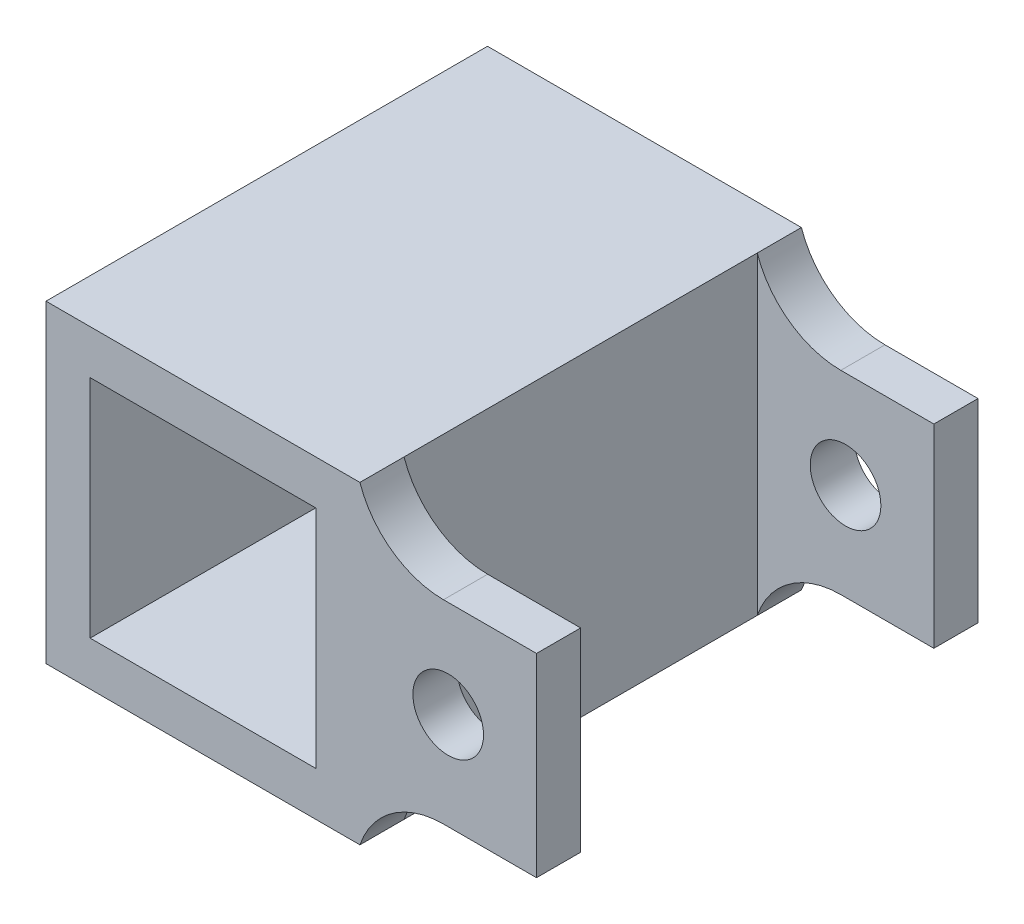
ISO-10303-21;
HEADER;
FILE_DESCRIPTION(('STEP AP214'),'2;1');
FILE_NAME('part.step','',(''),(''),'','','');
FILE_SCHEMA(('AUTOMOTIVE_DESIGN { 1 0 10303 214 1 1 1 1 }'));
ENDSEC;
DATA;
#1=APPLICATION_CONTEXT('core data for automotive mechanical design processes');
#2=APPLICATION_PROTOCOL_DEFINITION('international standard','automotive_design',2000,#1);
#3=PRODUCT_CONTEXT('',#1,'mechanical');
#4=PRODUCT('Part','Part','',(#3));
#5=PRODUCT_RELATED_PRODUCT_CATEGORY('part','',(#4));
#6=PRODUCT_DEFINITION_FORMATION('','',#4);
#7=PRODUCT_DEFINITION_CONTEXT('part definition',#1,'design');
#8=PRODUCT_DEFINITION('design','',#6,#7);
#9=PRODUCT_DEFINITION_SHAPE('','',#8);
#10=(LENGTH_UNIT() NAMED_UNIT(*) SI_UNIT(.MILLI.,.METRE.));
#11=(NAMED_UNIT(*) PLANE_ANGLE_UNIT() SI_UNIT($,.RADIAN.));
#12=(NAMED_UNIT(*) SI_UNIT($,.STERADIAN.) SOLID_ANGLE_UNIT());
#13=UNCERTAINTY_MEASURE_WITH_UNIT(LENGTH_MEASURE(1.E-05),#10,'distance_accuracy_value','');
#14=(GEOMETRIC_REPRESENTATION_CONTEXT(3) GLOBAL_UNCERTAINTY_ASSIGNED_CONTEXT((#13)) GLOBAL_UNIT_ASSIGNED_CONTEXT((#10,
#11,#12)) REPRESENTATION_CONTEXT('',''));
#15=CARTESIAN_POINT('',(0.,0.,0.));
#16=DIRECTION('',(0.,0.,1.));
#17=DIRECTION('',(1.,0.,0.));
#18=AXIS2_PLACEMENT_3D('',#15,#16,#17);
#19=CARTESIAN_POINT('',(17.775,-17.775,25.));
#20=DIRECTION('',(-1.,0.,0.));
#21=DIRECTION('',(0.,0.,1.));
#22=AXIS2_PLACEMENT_3D('',#19,#20,#21);
#23=PLANE('',#22);
#24=DIRECTION('',(0.,0.,-1.));
#25=VECTOR('',#24,1.);
#26=CARTESIAN_POINT('',(17.775,-17.775,25.));
#27=LINE('',#26,#25);
#28=CARTESIAN_POINT('',(17.775,-17.775,20.));
#29=VERTEX_POINT('',#28);
#30=CARTESIAN_POINT('',(17.775,-17.775,-20.));
#31=VERTEX_POINT('',#30);
#32=EDGE_CURVE('E316',#29,#31,#27,.T.);
#33=ORIENTED_EDGE('',*,*,#32,.T.);
#34=DIRECTION('',(0.,-1.,0.));
#35=VECTOR('',#34,1.);
#36=CARTESIAN_POINT('',(17.775,11.,-20.));
#37=LINE('',#36,#35);
#38=CARTESIAN_POINT('',(17.775,17.775,-20.));
#39=VERTEX_POINT('',#38);
#40=EDGE_CURVE('E182',#39,#31,#37,.T.);
#41=ORIENTED_EDGE('',*,*,#40,.F.);
#42=DIRECTION('',(0.,0.,-1.));
#43=VECTOR('',#42,1.);
#44=CARTESIAN_POINT('',(17.775,17.775,25.));
#45=LINE('',#44,#43);
#46=CARTESIAN_POINT('',(17.775,17.775,20.));
#47=VERTEX_POINT('',#46);
#48=EDGE_CURVE('E311',#47,#39,#45,.T.);
#49=ORIENTED_EDGE('',*,*,#48,.F.);
#50=DIRECTION('',(0.,-1.,0.));
#51=VECTOR('',#50,1.);
#52=CARTESIAN_POINT('',(17.775,11.,20.));
#53=LINE('',#52,#51);
#54=EDGE_CURVE('E202',#47,#29,#53,.T.);
#55=ORIENTED_EDGE('',*,*,#54,.T.);
#56=EDGE_LOOP('',(#33,#41,#49,#55));
#57=FACE_BOUND('',#56,.T.);
#58=ADVANCED_FACE('F37',(#57),#23,.F.);
#59=CARTESIAN_POINT('',(0.,0.,25.));
#60=DIRECTION('',(0.,0.,1.));
#61=DIRECTION('',(1.,0.,0.));
#62=AXIS2_PLACEMENT_3D('',#59,#60,#61);
#63=PLANE('',#62);
#64=DIRECTION('',(0.,-1.,0.));
#65=VECTOR('',#64,1.);
#66=CARTESIAN_POINT('',(-17.775,-17.775,25.));
#67=LINE('',#66,#65);
#68=CARTESIAN_POINT('',(-17.775,17.775,25.));
#69=VERTEX_POINT('',#68);
#70=CARTESIAN_POINT('',(-17.775,-17.775,25.));
#71=VERTEX_POINT('',#70);
#72=EDGE_CURVE('E288',#69,#71,#67,.T.);
#73=ORIENTED_EDGE('',*,*,#72,.T.);
#74=DIRECTION('',(1.,0.,0.));
#75=VECTOR('',#74,1.);
#76=CARTESIAN_POINT('',(17.775,-17.775,25.));
#77=LINE('',#76,#75);
#78=CARTESIAN_POINT('',(17.775,-17.775,25.));
#79=VERTEX_POINT('',#78);
#80=EDGE_CURVE('E291',#71,#79,#77,.T.);
#81=ORIENTED_EDGE('',*,*,#80,.T.);
#82=CARTESIAN_POINT('',(27.2406946390637,-21.,25.));
#83=DIRECTION('',(0.,0.,1.));
#84=DIRECTION('',(1.,0.,0.));
#85=AXIS2_PLACEMENT_3D('',#82,#83,#84);
#86=CIRCLE('',#85,10.);
#87=CARTESIAN_POINT('',(27.2406946390637,-11.,25.));
#88=VERTEX_POINT('',#87);
#89=EDGE_CURVE('E352',#79,#88,#86,.F.);
#90=ORIENTED_EDGE('',*,*,#89,.T.);
#91=DIRECTION('',(1.,0.,0.));
#92=VECTOR('',#91,1.);
#93=CARTESIAN_POINT('',(37.775,-11.,25.));
#94=LINE('',#93,#92);
#95=CARTESIAN_POINT('',(37.775,-11.,25.));
#96=VERTEX_POINT('',#95);
#97=EDGE_CURVE('E199',#88,#96,#94,.T.);
#98=ORIENTED_EDGE('',*,*,#97,.T.);
#99=DIRECTION('',(0.,1.,0.));
#100=VECTOR('',#99,1.);
#101=CARTESIAN_POINT('',(37.775,11.,25.));
#102=LINE('',#101,#100);
#103=CARTESIAN_POINT('',(37.775,11.,25.));
#104=VERTEX_POINT('',#103);
#105=EDGE_CURVE('E215',#96,#104,#102,.T.);
#106=ORIENTED_EDGE('',*,*,#105,.T.);
#107=DIRECTION('',(-1.,0.,0.));
#108=VECTOR('',#107,1.);
#109=CARTESIAN_POINT('',(37.775,11.,25.));
#110=LINE('',#109,#108);
#111=CARTESIAN_POINT('',(27.2406946390637,11.,25.));
#112=VERTEX_POINT('',#111);
#113=EDGE_CURVE('E205',#104,#112,#110,.T.);
#114=ORIENTED_EDGE('',*,*,#113,.T.);
#115=CARTESIAN_POINT('',(27.2406946390637,21.,25.));
#116=DIRECTION('',(0.,0.,1.));
#117=DIRECTION('',(1.,0.,0.));
#118=AXIS2_PLACEMENT_3D('',#115,#116,#117);
#119=CIRCLE('',#118,10.);
#120=CARTESIAN_POINT('',(17.775,17.775,25.));
#121=VERTEX_POINT('',#120);
#122=EDGE_CURVE('E357',#112,#121,#119,.F.);
#123=ORIENTED_EDGE('',*,*,#122,.T.);
#124=DIRECTION('',(-1.,0.,0.));
#125=VECTOR('',#124,1.);
#126=CARTESIAN_POINT('',(17.775,17.775,25.));
#127=LINE('',#126,#125);
#128=EDGE_CURVE('E295',#121,#69,#127,.T.);
#129=ORIENTED_EDGE('',*,*,#128,.T.);
#130=EDGE_LOOP('',(#73,#81,#90,#98,#106,#114,#123,#129));
#131=FACE_BOUND('',#130,.T.);
#132=DIRECTION('',(-1.,0.,0.));
#133=VECTOR('',#132,1.);
#134=CARTESIAN_POINT('',(-12.775,12.775,25.));
#135=LINE('',#134,#133);
#136=CARTESIAN_POINT('',(12.775,12.775,25.));
#137=VERTEX_POINT('',#136);
#138=CARTESIAN_POINT('',(-12.775,12.775,25.));
#139=VERTEX_POINT('',#138);
#140=EDGE_CURVE('E257',#137,#139,#135,.T.);
#141=ORIENTED_EDGE('',*,*,#140,.F.);
#142=DIRECTION('',(0.,1.,0.));
#143=VECTOR('',#142,1.);
#144=CARTESIAN_POINT('',(12.775,-12.775,25.));
#145=LINE('',#144,#143);
#146=CARTESIAN_POINT('',(12.775,-12.775,25.));
#147=VERTEX_POINT('',#146);
#148=EDGE_CURVE('E255',#147,#137,#145,.T.);
#149=ORIENTED_EDGE('',*,*,#148,.F.);
#150=DIRECTION('',(1.,0.,0.));
#151=VECTOR('',#150,1.);
#152=CARTESIAN_POINT('',(-12.775,-12.775,25.));
#153=LINE('',#152,#151);
#154=CARTESIAN_POINT('',(-12.775,-12.775,25.));
#155=VERTEX_POINT('',#154);
#156=EDGE_CURVE('E263',#155,#147,#153,.T.);
#157=ORIENTED_EDGE('',*,*,#156,.F.);
#158=DIRECTION('',(0.,-1.,0.));
#159=VECTOR('',#158,1.);
#160=CARTESIAN_POINT('',(-12.775,-12.775,25.));
#161=LINE('',#160,#159);
#162=EDGE_CURVE('E260',#139,#155,#161,.T.);
#163=ORIENTED_EDGE('',*,*,#162,.F.);
#164=EDGE_LOOP('',(#141,#149,#157,#163));
#165=FACE_BOUND('',#164,.T.);
#166=CARTESIAN_POINT('',(27.775,0.,25.));
#167=DIRECTION('',(0.,0.,1.));
#168=DIRECTION('',(1.,0.,0.));
#169=AXIS2_PLACEMENT_3D('',#166,#167,#168);
#170=CIRCLE('',#169,4.00000000000001);
#171=CARTESIAN_POINT('',(31.775,0.,25.));
#172=VERTEX_POINT('',#171);
#173=EDGE_CURVE('E194',#172,#172,#170,.T.);
#174=ORIENTED_EDGE('',*,*,#173,.F.);
#175=EDGE_LOOP('',(#174));
#176=FACE_BOUND('',#175,.T.);
#177=ADVANCED_FACE('F404',(#131,#165,#176),#63,.T.);
#178=CARTESIAN_POINT('',(0.,0.,-25.));
#179=DIRECTION('',(0.,0.,1.));
#180=DIRECTION('',(1.,0.,0.));
#181=AXIS2_PLACEMENT_3D('',#178,#179,#180);
#182=PLANE('',#181);
#183=DIRECTION('',(0.,-1.,0.));
#184=VECTOR('',#183,1.);
#185=CARTESIAN_POINT('',(-17.775,-17.775,-25.));
#186=LINE('',#185,#184);
#187=CARTESIAN_POINT('',(-17.775,17.775,-25.));
#188=VERTEX_POINT('',#187);
#189=CARTESIAN_POINT('',(-17.775,-17.775,-25.));
#190=VERTEX_POINT('',#189);
#191=EDGE_CURVE('E287',#188,#190,#186,.T.);
#192=ORIENTED_EDGE('',*,*,#191,.F.);
#193=DIRECTION('',(-1.,0.,0.));
#194=VECTOR('',#193,1.);
#195=CARTESIAN_POINT('',(17.775,17.775,-25.));
#196=LINE('',#195,#194);
#197=CARTESIAN_POINT('',(17.775,17.775,-25.));
#198=VERTEX_POINT('',#197);
#199=EDGE_CURVE('E292',#198,#188,#196,.T.);
#200=ORIENTED_EDGE('',*,*,#199,.F.);
#201=CARTESIAN_POINT('',(27.2406946390637,21.,-25.));
#202=DIRECTION('',(0.,0.,1.));
#203=DIRECTION('',(1.,0.,0.));
#204=AXIS2_PLACEMENT_3D('',#201,#202,#203);
#205=CIRCLE('',#204,10.);
#206=CARTESIAN_POINT('',(27.2406946390637,11.,-25.));
#207=VERTEX_POINT('',#206);
#208=EDGE_CURVE('E45',#198,#207,#205,.T.);
#209=ORIENTED_EDGE('',*,*,#208,.T.);
#210=DIRECTION('',(-1.,0.,0.));
#211=VECTOR('',#210,1.);
#212=CARTESIAN_POINT('',(37.775,11.,-25.));
#213=LINE('',#212,#211);
#214=CARTESIAN_POINT('',(37.775,11.,-25.));
#215=VERTEX_POINT('',#214);
#216=EDGE_CURVE('E189',#215,#207,#213,.T.);
#217=ORIENTED_EDGE('',*,*,#216,.F.);
#218=DIRECTION('',(0.,1.,0.));
#219=VECTOR('',#218,1.);
#220=CARTESIAN_POINT('',(37.775,11.,-25.));
#221=LINE('',#220,#219);
#222=CARTESIAN_POINT('',(37.775,-11.,-25.));
#223=VERTEX_POINT('',#222);
#224=EDGE_CURVE('E178',#223,#215,#221,.T.);
#225=ORIENTED_EDGE('',*,*,#224,.F.);
#226=DIRECTION('',(1.,0.,0.));
#227=VECTOR('',#226,1.);
#228=CARTESIAN_POINT('',(37.775,-11.,-25.));
#229=LINE('',#228,#227);
#230=CARTESIAN_POINT('',(27.2406946390637,-11.,-25.));
#231=VERTEX_POINT('',#230);
#232=EDGE_CURVE('E184',#231,#223,#229,.T.);
#233=ORIENTED_EDGE('',*,*,#232,.F.);
#234=CARTESIAN_POINT('',(27.2406946390637,-21.,-25.));
#235=DIRECTION('',(0.,0.,1.));
#236=DIRECTION('',(1.,0.,0.));
#237=AXIS2_PLACEMENT_3D('',#234,#235,#236);
#238=CIRCLE('',#237,10.);
#239=CARTESIAN_POINT('',(17.775,-17.775,-25.));
#240=VERTEX_POINT('',#239);
#241=EDGE_CURVE('E365',#231,#240,#238,.T.);
#242=ORIENTED_EDGE('',*,*,#241,.T.);
#243=DIRECTION('',(1.,0.,0.));
#244=VECTOR('',#243,1.);
#245=CARTESIAN_POINT('',(17.775,-17.775,-25.));
#246=LINE('',#245,#244);
#247=EDGE_CURVE('E300',#190,#240,#246,.T.);
#248=ORIENTED_EDGE('',*,*,#247,.F.);
#249=EDGE_LOOP('',(#192,#200,#209,#217,#225,#233,#242,#248));
#250=FACE_BOUND('',#249,.T.);
#251=DIRECTION('',(0.,1.,0.));
#252=VECTOR('',#251,1.);
#253=CARTESIAN_POINT('',(12.775,-12.775,-25.));
#254=LINE('',#253,#252);
#255=CARTESIAN_POINT('',(12.775,-12.775,-25.));
#256=VERTEX_POINT('',#255);
#257=CARTESIAN_POINT('',(12.775,12.775,-25.));
#258=VERTEX_POINT('',#257);
#259=EDGE_CURVE('E266',#256,#258,#254,.T.);
#260=ORIENTED_EDGE('',*,*,#259,.T.);
#261=DIRECTION('',(-1.,0.,0.));
#262=VECTOR('',#261,1.);
#263=CARTESIAN_POINT('',(-12.775,12.775,-25.));
#264=LINE('',#263,#262);
#265=CARTESIAN_POINT('',(-12.775,12.775,-25.));
#266=VERTEX_POINT('',#265);
#267=EDGE_CURVE('E269',#258,#266,#264,.T.);
#268=ORIENTED_EDGE('',*,*,#267,.T.);
#269=DIRECTION('',(0.,-1.,0.));
#270=VECTOR('',#269,1.);
#271=CARTESIAN_POINT('',(-12.775,-12.775,-25.));
#272=LINE('',#271,#270);
#273=CARTESIAN_POINT('',(-12.775,-12.775,-25.));
#274=VERTEX_POINT('',#273);
#275=EDGE_CURVE('E273',#266,#274,#272,.T.);
#276=ORIENTED_EDGE('',*,*,#275,.T.);
#277=DIRECTION('',(1.,0.,0.));
#278=VECTOR('',#277,1.);
#279=CARTESIAN_POINT('',(-12.775,-12.775,-25.));
#280=LINE('',#279,#278);
#281=EDGE_CURVE('E258',#274,#256,#280,.T.);
#282=ORIENTED_EDGE('',*,*,#281,.T.);
#283=EDGE_LOOP('',(#260,#268,#276,#282));
#284=FACE_BOUND('',#283,.T.);
#285=CARTESIAN_POINT('',(27.775,0.,-25.));
#286=DIRECTION('',(0.,0.,1.));
#287=DIRECTION('',(1.,0.,0.));
#288=AXIS2_PLACEMENT_3D('',#285,#286,#287);
#289=CIRCLE('',#288,4.00000000000001);
#290=CARTESIAN_POINT('',(31.775,0.,-25.));
#291=VERTEX_POINT('',#290);
#292=EDGE_CURVE('E824',#291,#291,#289,.T.);
#293=ORIENTED_EDGE('',*,*,#292,.T.);
#294=EDGE_LOOP('',(#293));
#295=FACE_BOUND('',#294,.T.);
#296=ADVANCED_FACE('F378',(#250,#284,#295),#182,.F.);
#297=CARTESIAN_POINT('',(-17.775,-17.775,25.));
#298=DIRECTION('',(1.,0.,0.));
#299=DIRECTION('',(0.,0.,-1.));
#300=AXIS2_PLACEMENT_3D('',#297,#298,#299);
#301=PLANE('',#300);
#302=CARTESIAN_POINT('',(-17.775,-1.975,-15.6));
#303=DIRECTION('',(1.,0.,0.));
#304=DIRECTION('',(0.,0.,-1.));
#305=AXIS2_PLACEMENT_3D('',#302,#303,#304);
#306=CIRCLE('',#305,1.25);
#307=CARTESIAN_POINT('',(-17.775,-1.975,-16.85));
#308=VERTEX_POINT('',#307);
#309=EDGE_CURVE('E270',#308,#308,#306,.T.);
#310=ORIENTED_EDGE('',*,*,#309,.T.);
#311=EDGE_LOOP('',(#310));
#312=FACE_BOUND('',#311,.T.);
#313=CARTESIAN_POINT('',(-17.775,4.42500000000001,15.6));
#314=DIRECTION('',(1.,0.,0.));
#315=DIRECTION('',(0.,0.,-1.));
#316=AXIS2_PLACEMENT_3D('',#313,#314,#315);
#317=CIRCLE('',#316,1.25);
#318=CARTESIAN_POINT('',(-17.775,4.42500000000001,14.35));
#319=VERTEX_POINT('',#318);
#320=EDGE_CURVE('E343',#319,#319,#317,.T.);
#321=ORIENTED_EDGE('',*,*,#320,.T.);
#322=EDGE_LOOP('',(#321));
#323=FACE_BOUND('',#322,.T.);
#324=CARTESIAN_POINT('',(-17.775,4.425,-15.6));
#325=DIRECTION('',(1.,0.,0.));
#326=DIRECTION('',(0.,0.,-1.));
#327=AXIS2_PLACEMENT_3D('',#324,#325,#326);
#328=CIRCLE('',#327,1.25);
#329=CARTESIAN_POINT('',(-17.775,4.425,-16.85));
#330=VERTEX_POINT('',#329);
#331=EDGE_CURVE('E340',#330,#330,#328,.T.);
#332=ORIENTED_EDGE('',*,*,#331,.T.);
#333=EDGE_LOOP('',(#332));
#334=FACE_BOUND('',#333,.T.);
#335=CARTESIAN_POINT('',(-17.775,10.825,15.6));
#336=DIRECTION('',(1.,0.,0.));
#337=DIRECTION('',(0.,0.,-1.));
#338=AXIS2_PLACEMENT_3D('',#335,#336,#337);
#339=CIRCLE('',#338,1.25);
#340=CARTESIAN_POINT('',(-17.775,10.825,14.35));
#341=VERTEX_POINT('',#340);
#342=EDGE_CURVE('E337',#341,#341,#339,.T.);
#343=ORIENTED_EDGE('',*,*,#342,.T.);
#344=EDGE_LOOP('',(#343));
#345=FACE_BOUND('',#344,.T.);
#346=CARTESIAN_POINT('',(-17.775,-14.775,-15.6));
#347=DIRECTION('',(1.,0.,0.));
#348=DIRECTION('',(0.,0.,-1.));
#349=AXIS2_PLACEMENT_3D('',#346,#347,#348);
#350=CIRCLE('',#349,1.25);
#351=CARTESIAN_POINT('',(-17.775,-14.775,-16.85));
#352=VERTEX_POINT('',#351);
#353=EDGE_CURVE('E334',#352,#352,#350,.T.);
#354=ORIENTED_EDGE('',*,*,#353,.T.);
#355=EDGE_LOOP('',(#354));
#356=FACE_BOUND('',#355,.T.);
#357=CARTESIAN_POINT('',(-17.775,-8.37499999999999,15.6));
#358=DIRECTION('',(1.,0.,0.));
#359=DIRECTION('',(0.,0.,-1.));
#360=AXIS2_PLACEMENT_3D('',#357,#358,#359);
#361=CIRCLE('',#360,1.25);
#362=CARTESIAN_POINT('',(-17.775,-8.37499999999999,14.35));
#363=VERTEX_POINT('',#362);
#364=EDGE_CURVE('E331',#363,#363,#361,.T.);
#365=ORIENTED_EDGE('',*,*,#364,.T.);
#366=EDGE_LOOP('',(#365));
#367=FACE_BOUND('',#366,.T.);
#368=CARTESIAN_POINT('',(-17.775,-8.375,-15.6));
#369=DIRECTION('',(1.,0.,0.));
#370=DIRECTION('',(0.,0.,-1.));
#371=AXIS2_PLACEMENT_3D('',#368,#369,#370);
#372=CIRCLE('',#371,1.25);
#373=CARTESIAN_POINT('',(-17.775,-8.375,-16.85));
#374=VERTEX_POINT('',#373);
#375=EDGE_CURVE('E328',#374,#374,#372,.T.);
#376=ORIENTED_EDGE('',*,*,#375,.T.);
#377=EDGE_LOOP('',(#376));
#378=FACE_BOUND('',#377,.T.);
#379=CARTESIAN_POINT('',(-17.775,-1.97499999999999,15.6));
#380=DIRECTION('',(1.,0.,0.));
#381=DIRECTION('',(0.,0.,-1.));
#382=AXIS2_PLACEMENT_3D('',#379,#380,#381);
#383=CIRCLE('',#382,1.25);
#384=CARTESIAN_POINT('',(-17.775,-1.97499999999999,14.35));
#385=VERTEX_POINT('',#384);
#386=EDGE_CURVE('E325',#385,#385,#383,.T.);
#387=ORIENTED_EDGE('',*,*,#386,.T.);
#388=EDGE_LOOP('',(#387));
#389=FACE_BOUND('',#388,.T.);
#390=CARTESIAN_POINT('',(-17.775,10.825,-15.6));
#391=DIRECTION('',(1.,0.,0.));
#392=DIRECTION('',(0.,0.,-1.));
#393=AXIS2_PLACEMENT_3D('',#390,#391,#392);
#394=CIRCLE('',#393,1.25);
#395=CARTESIAN_POINT('',(-17.775,10.825,-16.85));
#396=VERTEX_POINT('',#395);
#397=EDGE_CURVE('E322',#396,#396,#394,.T.);
#398=ORIENTED_EDGE('',*,*,#397,.T.);
#399=EDGE_LOOP('',(#398));
#400=FACE_BOUND('',#399,.T.);
#401=CARTESIAN_POINT('',(-17.775,-14.775,15.6));
#402=DIRECTION('',(1.,0.,0.));
#403=DIRECTION('',(0.,0.,-1.));
#404=AXIS2_PLACEMENT_3D('',#401,#402,#403);
#405=CIRCLE('',#404,1.25);
#406=CARTESIAN_POINT('',(-17.775,-14.775,14.35));
#407=VERTEX_POINT('',#406);
#408=EDGE_CURVE('E254',#407,#407,#405,.T.);
#409=ORIENTED_EDGE('',*,*,#408,.T.);
#410=EDGE_LOOP('',(#409));
#411=FACE_BOUND('',#410,.T.);
#412=ORIENTED_EDGE('',*,*,#191,.T.);
#413=DIRECTION('',(0.,0.,-1.));
#414=VECTOR('',#413,1.);
#415=CARTESIAN_POINT('',(-17.775,-17.775,25.));
#416=LINE('',#415,#414);
#417=EDGE_CURVE('E315',#71,#190,#416,.T.);
#418=ORIENTED_EDGE('',*,*,#417,.F.);
#419=ORIENTED_EDGE('',*,*,#72,.F.);
#420=DIRECTION('',(0.,0.,-1.));
#421=VECTOR('',#420,1.);
#422=CARTESIAN_POINT('',(-17.775,17.775,25.));
#423=LINE('',#422,#421);
#424=EDGE_CURVE('E297',#69,#188,#423,.T.);
#425=ORIENTED_EDGE('',*,*,#424,.T.);
#426=EDGE_LOOP('',(#412,#418,#419,#425));
#427=FACE_BOUND('',#426,.T.);
#428=ADVANCED_FACE('F388',(#312,#323,#334,#345,#356,#367,#378,#389,#400,#411,#427),#301,.F.);
#429=CARTESIAN_POINT('',(17.775,-17.775,25.));
#430=DIRECTION('',(0.,1.,0.));
#431=DIRECTION('',(0.,0.,1.));
#432=AXIS2_PLACEMENT_3D('',#429,#430,#431);
#433=PLANE('',#432);
#434=ORIENTED_EDGE('',*,*,#247,.T.);
#435=EDGE_CURVE('E310',#31,#240,#27,.T.);
#436=ORIENTED_EDGE('',*,*,#435,.F.);
#437=ORIENTED_EDGE('',*,*,#32,.F.);
#438=EDGE_CURVE('E312',#79,#29,#27,.T.);
#439=ORIENTED_EDGE('',*,*,#438,.F.);
#440=ORIENTED_EDGE('',*,*,#80,.F.);
#441=ORIENTED_EDGE('',*,*,#417,.T.);
#442=EDGE_LOOP('',(#434,#436,#437,#439,#440,#441));
#443=FACE_BOUND('',#442,.T.);
#444=ADVANCED_FACE('F381',(#443),#433,.F.);
#445=CARTESIAN_POINT('',(17.775,17.775,25.));
#446=DIRECTION('',(0.,-1.,0.));
#447=DIRECTION('',(0.,0.,-1.));
#448=AXIS2_PLACEMENT_3D('',#445,#446,#447);
#449=PLANE('',#448);
#450=ORIENTED_EDGE('',*,*,#199,.T.);
#451=ORIENTED_EDGE('',*,*,#424,.F.);
#452=ORIENTED_EDGE('',*,*,#128,.F.);
#453=EDGE_CURVE('E307',#121,#47,#45,.T.);
#454=ORIENTED_EDGE('',*,*,#453,.T.);
#455=ORIENTED_EDGE('',*,*,#48,.T.);
#456=EDGE_CURVE('E306',#39,#198,#45,.T.);
#457=ORIENTED_EDGE('',*,*,#456,.T.);
#458=EDGE_LOOP('',(#450,#451,#452,#454,#455,#457));
#459=FACE_BOUND('',#458,.T.);
#460=ADVANCED_FACE('F392',(#459),#449,.F.);
#461=CARTESIAN_POINT('',(12.775,-12.775,25.));
#462=DIRECTION('',(-1.,0.,0.));
#463=DIRECTION('',(0.,0.,1.));
#464=AXIS2_PLACEMENT_3D('',#461,#462,#463);
#465=PLANE('',#464);
#466=ORIENTED_EDGE('',*,*,#259,.F.);
#467=DIRECTION('',(0.,0.,-1.));
#468=VECTOR('',#467,1.);
#469=CARTESIAN_POINT('',(12.775,-12.775,25.));
#470=LINE('',#469,#468);
#471=EDGE_CURVE('E265',#147,#256,#470,.T.);
#472=ORIENTED_EDGE('',*,*,#471,.F.);
#473=ORIENTED_EDGE('',*,*,#148,.T.);
#474=DIRECTION('',(0.,0.,-1.));
#475=VECTOR('',#474,1.);
#476=CARTESIAN_POINT('',(12.775,12.775,25.));
#477=LINE('',#476,#475);
#478=EDGE_CURVE('E284',#137,#258,#477,.T.);
#479=ORIENTED_EDGE('',*,*,#478,.T.);
#480=EDGE_LOOP('',(#466,#472,#473,#479));
#481=FACE_BOUND('',#480,.T.);
#482=ADVANCED_FACE('F555',(#481),#465,.T.);
#483=CARTESIAN_POINT('',(-12.775,12.775,25.));
#484=DIRECTION('',(0.,-1.,0.));
#485=DIRECTION('',(0.,0.,-1.));
#486=AXIS2_PLACEMENT_3D('',#483,#484,#485);
#487=PLANE('',#486);
#488=ORIENTED_EDGE('',*,*,#267,.F.);
#489=ORIENTED_EDGE('',*,*,#478,.F.);
#490=ORIENTED_EDGE('',*,*,#140,.T.);
#491=DIRECTION('',(0.,0.,-1.));
#492=VECTOR('',#491,1.);
#493=CARTESIAN_POINT('',(-12.775,12.775,25.));
#494=LINE('',#493,#492);
#495=EDGE_CURVE('E282',#139,#266,#494,.T.);
#496=ORIENTED_EDGE('',*,*,#495,.T.);
#497=EDGE_LOOP('',(#488,#489,#490,#496));
#498=FACE_BOUND('',#497,.T.);
#499=ADVANCED_FACE('F551',(#498),#487,.T.);
#500=CARTESIAN_POINT('',(-12.775,-12.775,25.));
#501=DIRECTION('',(1.,0.,0.));
#502=DIRECTION('',(0.,0.,-1.));
#503=AXIS2_PLACEMENT_3D('',#500,#501,#502);
#504=PLANE('',#503);
#505=ORIENTED_EDGE('',*,*,#275,.F.);
#506=ORIENTED_EDGE('',*,*,#495,.F.);
#507=ORIENTED_EDGE('',*,*,#162,.T.);
#508=DIRECTION('',(0.,0.,-1.));
#509=VECTOR('',#508,1.);
#510=CARTESIAN_POINT('',(-12.775,-12.775,25.));
#511=LINE('',#510,#509);
#512=EDGE_CURVE('E280',#155,#274,#511,.T.);
#513=ORIENTED_EDGE('',*,*,#512,.T.);
#514=EDGE_LOOP('',(#505,#506,#507,#513));
#515=FACE_BOUND('',#514,.T.);
#516=ADVANCED_FACE('F547',(#515),#504,.T.);
#517=CARTESIAN_POINT('',(-12.775,-12.775,25.));
#518=DIRECTION('',(0.,1.,0.));
#519=DIRECTION('',(0.,0.,1.));
#520=AXIS2_PLACEMENT_3D('',#517,#518,#519);
#521=PLANE('',#520);
#522=ORIENTED_EDGE('',*,*,#281,.F.);
#523=ORIENTED_EDGE('',*,*,#512,.F.);
#524=ORIENTED_EDGE('',*,*,#156,.T.);
#525=ORIENTED_EDGE('',*,*,#471,.T.);
#526=EDGE_LOOP('',(#522,#523,#524,#525));
#527=FACE_BOUND('',#526,.T.);
#528=ADVANCED_FACE('F543',(#527),#521,.T.);
#529=CARTESIAN_POINT('',(-13.775,-14.775,15.6));
#530=DIRECTION('',(-1.,0.,0.));
#531=DIRECTION('',(0.,0.,1.));
#532=AXIS2_PLACEMENT_3D('',#529,#530,#531);
#533=CYLINDRICAL_SURFACE('',#532,1.25);
#534=CARTESIAN_POINT('',(-13.775,-14.775,15.6));
#535=DIRECTION('',(-1.,0.,0.));
#536=DIRECTION('',(0.,0.,1.));
#537=AXIS2_PLACEMENT_3D('',#534,#535,#536);
#538=CIRCLE('',#537,1.25);
#539=CARTESIAN_POINT('',(-13.775,-14.775,16.85));
#540=VERTEX_POINT('',#539);
#541=EDGE_CURVE('E249',#540,#540,#538,.T.);
#542=ORIENTED_EDGE('',*,*,#541,.F.);
#543=EDGE_LOOP('',(#542));
#544=FACE_BOUND('',#543,.T.);
#545=ORIENTED_EDGE('',*,*,#408,.F.);
#546=EDGE_LOOP('',(#545));
#547=FACE_BOUND('',#546,.T.);
#548=ADVANCED_FACE('F539',(#544,#547),#533,.F.);
#549=CARTESIAN_POINT('',(-13.775,-14.775,15.6));
#550=DIRECTION('',(-1.,0.,0.));
#551=DIRECTION('',(0.,0.,1.));
#552=AXIS2_PLACEMENT_3D('',#549,#550,#551);
#553=PLANE('',#552);
#554=ORIENTED_EDGE('',*,*,#541,.T.);
#555=EDGE_LOOP('',(#554));
#556=FACE_BOUND('',#555,.T.);
#557=ADVANCED_FACE('F472',(#556),#553,.T.);
#558=CARTESIAN_POINT('',(-13.775,10.825,-15.6));
#559=DIRECTION('',(-1.,0.,0.));
#560=DIRECTION('',(0.,0.,1.));
#561=AXIS2_PLACEMENT_3D('',#558,#559,#560);
#562=CYLINDRICAL_SURFACE('',#561,1.25);
#563=CARTESIAN_POINT('',(-13.775,10.825,-15.6));
#564=DIRECTION('',(-1.,0.,0.));
#565=DIRECTION('',(0.,0.,1.));
#566=AXIS2_PLACEMENT_3D('',#563,#564,#565);
#567=CIRCLE('',#566,1.25);
#568=CARTESIAN_POINT('',(-13.775,10.825,-14.35));
#569=VERTEX_POINT('',#568);
#570=EDGE_CURVE('E222',#569,#569,#567,.T.);
#571=ORIENTED_EDGE('',*,*,#570,.F.);
#572=EDGE_LOOP('',(#571));
#573=FACE_BOUND('',#572,.T.);
#574=ORIENTED_EDGE('',*,*,#397,.F.);
#575=EDGE_LOOP('',(#574));
#576=FACE_BOUND('',#575,.T.);
#577=ADVANCED_FACE('F468',(#573,#576),#562,.F.);
#578=CARTESIAN_POINT('',(-13.775,10.825,-15.6));
#579=DIRECTION('',(-1.,0.,0.));
#580=DIRECTION('',(0.,0.,1.));
#581=AXIS2_PLACEMENT_3D('',#578,#579,#580);
#582=PLANE('',#581);
#583=ORIENTED_EDGE('',*,*,#570,.T.);
#584=EDGE_LOOP('',(#583));
#585=FACE_BOUND('',#584,.T.);
#586=ADVANCED_FACE('F464',(#585),#582,.T.);
#587=CARTESIAN_POINT('',(-13.775,-1.97499999999999,15.6));
#588=DIRECTION('',(-1.,0.,0.));
#589=DIRECTION('',(0.,0.,1.));
#590=AXIS2_PLACEMENT_3D('',#587,#588,#589);
#591=CYLINDRICAL_SURFACE('',#590,1.25);
#592=CARTESIAN_POINT('',(-13.775,-1.97499999999999,15.6));
#593=DIRECTION('',(-1.,0.,0.));
#594=DIRECTION('',(0.,0.,1.));
#595=AXIS2_PLACEMENT_3D('',#592,#593,#594);
#596=CIRCLE('',#595,1.25);
#597=CARTESIAN_POINT('',(-13.775,-1.97499999999999,16.85));
#598=VERTEX_POINT('',#597);
#599=EDGE_CURVE('E237',#598,#598,#596,.T.);
#600=ORIENTED_EDGE('',*,*,#599,.F.);
#601=EDGE_LOOP('',(#600));
#602=FACE_BOUND('',#601,.T.);
#603=ORIENTED_EDGE('',*,*,#386,.F.);
#604=EDGE_LOOP('',(#603));
#605=FACE_BOUND('',#604,.T.);
#606=ADVANCED_FACE('F467',(#602,#605),#591,.F.);
#607=CARTESIAN_POINT('',(-13.775,-1.97499999999999,15.6));
#608=DIRECTION('',(-1.,0.,0.));
#609=DIRECTION('',(0.,0.,1.));
#610=AXIS2_PLACEMENT_3D('',#607,#608,#609);
#611=PLANE('',#610);
#612=ORIENTED_EDGE('',*,*,#599,.T.);
#613=EDGE_LOOP('',(#612));
#614=FACE_BOUND('',#613,.T.);
#615=ADVANCED_FACE('F515',(#614),#611,.T.);
#616=CARTESIAN_POINT('',(-13.775,-8.375,-15.6));
#617=DIRECTION('',(-1.,0.,0.));
#618=DIRECTION('',(0.,0.,1.));
#619=AXIS2_PLACEMENT_3D('',#616,#617,#618);
#620=CYLINDRICAL_SURFACE('',#619,1.25);
#621=CARTESIAN_POINT('',(-13.775,-8.375,-15.6));
#622=DIRECTION('',(-1.,0.,0.));
#623=DIRECTION('',(0.,0.,1.));
#624=AXIS2_PLACEMENT_3D('',#621,#622,#623);
#625=CIRCLE('',#624,1.25);
#626=CARTESIAN_POINT('',(-13.775,-8.375,-14.35));
#627=VERTEX_POINT('',#626);
#628=EDGE_CURVE('E240',#627,#627,#625,.T.);
#629=ORIENTED_EDGE('',*,*,#628,.F.);
#630=EDGE_LOOP('',(#629));
#631=FACE_BOUND('',#630,.T.);
#632=ORIENTED_EDGE('',*,*,#375,.F.);
#633=EDGE_LOOP('',(#632));
#634=FACE_BOUND('',#633,.T.);
#635=ADVANCED_FACE('F511',(#631,#634),#620,.F.);
#636=CARTESIAN_POINT('',(-13.775,-8.375,-15.6));
#637=DIRECTION('',(-1.,0.,0.));
#638=DIRECTION('',(0.,0.,1.));
#639=AXIS2_PLACEMENT_3D('',#636,#637,#638);
#640=PLANE('',#639);
#641=ORIENTED_EDGE('',*,*,#628,.T.);
#642=EDGE_LOOP('',(#641));
#643=FACE_BOUND('',#642,.T.);
#644=ADVANCED_FACE('F507',(#643),#640,.T.);
#645=CARTESIAN_POINT('',(-13.775,-8.37499999999999,15.6));
#646=DIRECTION('',(-1.,0.,0.));
#647=DIRECTION('',(0.,0.,1.));
#648=AXIS2_PLACEMENT_3D('',#645,#646,#647);
#649=CYLINDRICAL_SURFACE('',#648,1.25);
#650=CARTESIAN_POINT('',(-13.775,-8.37499999999999,15.6));
#651=DIRECTION('',(-1.,0.,0.));
#652=DIRECTION('',(0.,0.,1.));
#653=AXIS2_PLACEMENT_3D('',#650,#651,#652);
#654=CIRCLE('',#653,1.25);
#655=CARTESIAN_POINT('',(-13.775,-8.37499999999999,16.85));
#656=VERTEX_POINT('',#655);
#657=EDGE_CURVE('E243',#656,#656,#654,.T.);
#658=ORIENTED_EDGE('',*,*,#657,.F.);
#659=EDGE_LOOP('',(#658));
#660=FACE_BOUND('',#659,.T.);
#661=ORIENTED_EDGE('',*,*,#364,.F.);
#662=EDGE_LOOP('',(#661));
#663=FACE_BOUND('',#662,.T.);
#664=ADVANCED_FACE('F510',(#660,#663),#649,.F.);
#665=CARTESIAN_POINT('',(-13.775,-8.37499999999999,15.6));
#666=DIRECTION('',(-1.,0.,0.));
#667=DIRECTION('',(0.,0.,1.));
#668=AXIS2_PLACEMENT_3D('',#665,#666,#667);
#669=PLANE('',#668);
#670=ORIENTED_EDGE('',*,*,#657,.T.);
#671=EDGE_LOOP('',(#670));
#672=FACE_BOUND('',#671,.T.);
#673=ADVANCED_FACE('F529',(#672),#669,.T.);
#674=CARTESIAN_POINT('',(-13.775,-14.775,-15.6));
#675=DIRECTION('',(-1.,0.,0.));
#676=DIRECTION('',(0.,0.,1.));
#677=AXIS2_PLACEMENT_3D('',#674,#675,#676);
#678=CYLINDRICAL_SURFACE('',#677,1.25);
#679=CARTESIAN_POINT('',(-13.775,-14.775,-15.6));
#680=DIRECTION('',(-1.,0.,0.));
#681=DIRECTION('',(0.,0.,1.));
#682=AXIS2_PLACEMENT_3D('',#679,#680,#681);
#683=CIRCLE('',#682,1.25);
#684=CARTESIAN_POINT('',(-13.775,-14.775,-14.35));
#685=VERTEX_POINT('',#684);
#686=EDGE_CURVE('E246',#685,#685,#683,.T.);
#687=ORIENTED_EDGE('',*,*,#686,.F.);
#688=EDGE_LOOP('',(#687));
#689=FACE_BOUND('',#688,.T.);
#690=ORIENTED_EDGE('',*,*,#353,.F.);
#691=EDGE_LOOP('',(#690));
#692=FACE_BOUND('',#691,.T.);
#693=ADVANCED_FACE('F525',(#689,#692),#678,.F.);
#694=CARTESIAN_POINT('',(-13.775,-14.775,-15.6));
#695=DIRECTION('',(-1.,0.,0.));
#696=DIRECTION('',(0.,0.,1.));
#697=AXIS2_PLACEMENT_3D('',#694,#695,#696);
#698=PLANE('',#697);
#699=ORIENTED_EDGE('',*,*,#686,.T.);
#700=EDGE_LOOP('',(#699));
#701=FACE_BOUND('',#700,.T.);
#702=ADVANCED_FACE('F490',(#701),#698,.T.);
#703=CARTESIAN_POINT('',(-13.775,10.825,15.6));
#704=DIRECTION('',(-1.,0.,0.));
#705=DIRECTION('',(0.,0.,1.));
#706=AXIS2_PLACEMENT_3D('',#703,#704,#705);
#707=CYLINDRICAL_SURFACE('',#706,1.25);
#708=CARTESIAN_POINT('',(-13.775,10.825,15.6));
#709=DIRECTION('',(-1.,0.,0.));
#710=DIRECTION('',(0.,0.,1.));
#711=AXIS2_PLACEMENT_3D('',#708,#709,#710);
#712=CIRCLE('',#711,1.25);
#713=CARTESIAN_POINT('',(-13.775,10.825,16.85));
#714=VERTEX_POINT('',#713);
#715=EDGE_CURVE('E227',#714,#714,#712,.T.);
#716=ORIENTED_EDGE('',*,*,#715,.F.);
#717=EDGE_LOOP('',(#716));
#718=FACE_BOUND('',#717,.T.);
#719=ORIENTED_EDGE('',*,*,#342,.F.);
#720=EDGE_LOOP('',(#719));
#721=FACE_BOUND('',#720,.T.);
#722=ADVANCED_FACE('F486',(#718,#721),#707,.F.);
#723=CARTESIAN_POINT('',(-13.775,10.825,15.6));
#724=DIRECTION('',(-1.,0.,0.));
#725=DIRECTION('',(0.,0.,1.));
#726=AXIS2_PLACEMENT_3D('',#723,#724,#725);
#727=PLANE('',#726);
#728=ORIENTED_EDGE('',*,*,#715,.T.);
#729=EDGE_LOOP('',(#728));
#730=FACE_BOUND('',#729,.T.);
#731=ADVANCED_FACE('F482',(#730),#727,.T.);
#732=CARTESIAN_POINT('',(-13.775,4.425,-15.6));
#733=DIRECTION('',(-1.,0.,0.));
#734=DIRECTION('',(0.,0.,1.));
#735=AXIS2_PLACEMENT_3D('',#732,#733,#734);
#736=CYLINDRICAL_SURFACE('',#735,1.25);
#737=CARTESIAN_POINT('',(-13.775,4.425,-15.6));
#738=DIRECTION('',(-1.,0.,0.));
#739=DIRECTION('',(0.,0.,1.));
#740=AXIS2_PLACEMENT_3D('',#737,#738,#739);
#741=CIRCLE('',#740,1.25);
#742=CARTESIAN_POINT('',(-13.775,4.425,-14.35));
#743=VERTEX_POINT('',#742);
#744=EDGE_CURVE('E228',#743,#743,#741,.T.);
#745=ORIENTED_EDGE('',*,*,#744,.F.);
#746=EDGE_LOOP('',(#745));
#747=FACE_BOUND('',#746,.T.);
#748=ORIENTED_EDGE('',*,*,#331,.F.);
#749=EDGE_LOOP('',(#748));
#750=FACE_BOUND('',#749,.T.);
#751=ADVANCED_FACE('F478',(#747,#750),#736,.F.);
#752=CARTESIAN_POINT('',(-13.775,4.425,-15.6));
#753=DIRECTION('',(-1.,0.,0.));
#754=DIRECTION('',(0.,0.,1.));
#755=AXIS2_PLACEMENT_3D('',#752,#753,#754);
#756=PLANE('',#755);
#757=ORIENTED_EDGE('',*,*,#744,.T.);
#758=EDGE_LOOP('',(#757));
#759=FACE_BOUND('',#758,.T.);
#760=ADVANCED_FACE('F474',(#759),#756,.T.);
#761=CARTESIAN_POINT('',(-13.775,4.42500000000001,15.6));
#762=DIRECTION('',(-1.,0.,0.));
#763=DIRECTION('',(0.,0.,1.));
#764=AXIS2_PLACEMENT_3D('',#761,#762,#763);
#765=CYLINDRICAL_SURFACE('',#764,1.25);
#766=CARTESIAN_POINT('',(-13.775,4.42500000000001,15.6));
#767=DIRECTION('',(-1.,0.,0.));
#768=DIRECTION('',(0.,0.,1.));
#769=AXIS2_PLACEMENT_3D('',#766,#767,#768);
#770=CIRCLE('',#769,1.25);
#771=CARTESIAN_POINT('',(-13.775,4.42500000000001,16.85));
#772=VERTEX_POINT('',#771);
#773=EDGE_CURVE('E231',#772,#772,#770,.T.);
#774=ORIENTED_EDGE('',*,*,#773,.F.);
#775=EDGE_LOOP('',(#774));
#776=FACE_BOUND('',#775,.T.);
#777=ORIENTED_EDGE('',*,*,#320,.F.);
#778=EDGE_LOOP('',(#777));
#779=FACE_BOUND('',#778,.T.);
#780=ADVANCED_FACE('F477',(#776,#779),#765,.F.);
#781=CARTESIAN_POINT('',(-13.775,4.42500000000001,15.6));
#782=DIRECTION('',(-1.,0.,0.));
#783=DIRECTION('',(0.,0.,1.));
#784=AXIS2_PLACEMENT_3D('',#781,#782,#783);
#785=PLANE('',#784);
#786=ORIENTED_EDGE('',*,*,#773,.T.);
#787=EDGE_LOOP('',(#786));
#788=FACE_BOUND('',#787,.T.);
#789=ADVANCED_FACE('F499',(#788),#785,.T.);
#790=CARTESIAN_POINT('',(-13.775,-1.975,-15.6));
#791=DIRECTION('',(-1.,0.,0.));
#792=DIRECTION('',(0.,0.,1.));
#793=AXIS2_PLACEMENT_3D('',#790,#791,#792);
#794=CYLINDRICAL_SURFACE('',#793,1.25);
#795=CARTESIAN_POINT('',(-13.775,-1.975,-15.6));
#796=DIRECTION('',(-1.,0.,0.));
#797=DIRECTION('',(0.,0.,1.));
#798=AXIS2_PLACEMENT_3D('',#795,#796,#797);
#799=CIRCLE('',#798,1.25);
#800=CARTESIAN_POINT('',(-13.775,-1.975,-14.35));
#801=VERTEX_POINT('',#800);
#802=EDGE_CURVE('E234',#801,#801,#799,.T.);
#803=ORIENTED_EDGE('',*,*,#802,.F.);
#804=EDGE_LOOP('',(#803));
#805=FACE_BOUND('',#804,.T.);
#806=ORIENTED_EDGE('',*,*,#309,.F.);
#807=EDGE_LOOP('',(#806));
#808=FACE_BOUND('',#807,.T.);
#809=ADVANCED_FACE('F495',(#805,#808),#794,.F.);
#810=CARTESIAN_POINT('',(-13.775,-1.975,-15.6));
#811=DIRECTION('',(-1.,0.,0.));
#812=DIRECTION('',(0.,0.,1.));
#813=AXIS2_PLACEMENT_3D('',#810,#811,#812);
#814=PLANE('',#813);
#815=ORIENTED_EDGE('',*,*,#802,.T.);
#816=EDGE_LOOP('',(#815));
#817=FACE_BOUND('',#816,.T.);
#818=ADVANCED_FACE('F492',(#817),#814,.T.);
#819=CARTESIAN_POINT('',(37.775,11.,20.));
#820=DIRECTION('',(0.,1.,0.));
#821=DIRECTION('',(-1.,0.,0.));
#822=AXIS2_PLACEMENT_3D('',#819,#820,#821);
#823=PLANE('',#822);
#824=DIRECTION('',(-1.,0.,0.));
#825=VECTOR('',#824,1.);
#826=CARTESIAN_POINT('',(37.775,11.,20.));
#827=LINE('',#826,#825);
#828=CARTESIAN_POINT('',(37.775,11.,20.));
#829=VERTEX_POINT('',#828);
#830=CARTESIAN_POINT('',(27.2406946390637,11.,20.));
#831=VERTEX_POINT('',#830);
#832=EDGE_CURVE('E210',#829,#831,#827,.T.);
#833=ORIENTED_EDGE('',*,*,#832,.T.);
#834=DIRECTION('',(0.,0.,-1.));
#835=VECTOR('',#834,1.);
#836=CARTESIAN_POINT('',(27.2406946390637,11.,25.));
#837=LINE('',#836,#835);
#838=EDGE_CURVE('E349',#831,#112,#837,.F.);
#839=ORIENTED_EDGE('',*,*,#838,.T.);
#840=ORIENTED_EDGE('',*,*,#113,.F.);
#841=DIRECTION('',(0.,0.,1.));
#842=VECTOR('',#841,1.);
#843=CARTESIAN_POINT('',(37.775,11.,20.));
#844=LINE('',#843,#842);
#845=EDGE_CURVE('E220',#829,#104,#844,.T.);
#846=ORIENTED_EDGE('',*,*,#845,.F.);
#847=EDGE_LOOP('',(#833,#839,#840,#846));
#848=FACE_BOUND('',#847,.T.);
#849=ADVANCED_FACE('F440',(#848),#823,.T.);
#850=CARTESIAN_POINT('',(37.775,11.,20.));
#851=DIRECTION('',(1.,0.,0.));
#852=DIRECTION('',(0.,0.,-1.));
#853=AXIS2_PLACEMENT_3D('',#850,#851,#852);
#854=PLANE('',#853);
#855=ORIENTED_EDGE('',*,*,#105,.F.);
#856=DIRECTION('',(0.,0.,1.));
#857=VECTOR('',#856,1.);
#858=CARTESIAN_POINT('',(37.775,-11.,20.));
#859=LINE('',#858,#857);
#860=CARTESIAN_POINT('',(37.775,-11.,20.));
#861=VERTEX_POINT('',#860);
#862=EDGE_CURVE('E213',#861,#96,#859,.T.);
#863=ORIENTED_EDGE('',*,*,#862,.F.);
#864=DIRECTION('',(0.,1.,0.));
#865=VECTOR('',#864,1.);
#866=CARTESIAN_POINT('',(37.775,11.,20.));
#867=LINE('',#866,#865);
#868=EDGE_CURVE('E207',#861,#829,#867,.T.);
#869=ORIENTED_EDGE('',*,*,#868,.T.);
#870=ORIENTED_EDGE('',*,*,#845,.T.);
#871=EDGE_LOOP('',(#855,#863,#869,#870));
#872=FACE_BOUND('',#871,.T.);
#873=ADVANCED_FACE('F445',(#872),#854,.T.);
#874=CARTESIAN_POINT('',(37.775,-11.,20.));
#875=DIRECTION('',(0.,-1.,0.));
#876=DIRECTION('',(1.,0.,0.));
#877=AXIS2_PLACEMENT_3D('',#874,#875,#876);
#878=PLANE('',#877);
#879=ORIENTED_EDGE('',*,*,#97,.F.);
#880=DIRECTION('',(0.,0.,1.));
#881=VECTOR('',#880,1.);
#882=CARTESIAN_POINT('',(27.2406946390637,-11.,20.));
#883=LINE('',#882,#881);
#884=CARTESIAN_POINT('',(27.2406946390637,-11.,20.));
#885=VERTEX_POINT('',#884);
#886=EDGE_CURVE('E319',#88,#885,#883,.F.);
#887=ORIENTED_EDGE('',*,*,#886,.T.);
#888=DIRECTION('',(1.,0.,0.));
#889=VECTOR('',#888,1.);
#890=CARTESIAN_POINT('',(37.775,-11.,20.));
#891=LINE('',#890,#889);
#892=EDGE_CURVE('E204',#885,#861,#891,.T.);
#893=ORIENTED_EDGE('',*,*,#892,.T.);
#894=ORIENTED_EDGE('',*,*,#862,.T.);
#895=EDGE_LOOP('',(#879,#887,#893,#894));
#896=FACE_BOUND('',#895,.T.);
#897=ADVANCED_FACE('F452',(#896),#878,.T.);
#898=CARTESIAN_POINT('',(0.,0.,20.));
#899=DIRECTION('',(0.,0.,-1.));
#900=DIRECTION('',(-1.,0.,0.));
#901=AXIS2_PLACEMENT_3D('',#898,#899,#900);
#902=PLANE('',#901);
#903=CARTESIAN_POINT('',(27.775,0.,20.));
#904=DIRECTION('',(0.,0.,1.));
#905=DIRECTION('',(1.,0.,0.));
#906=AXIS2_PLACEMENT_3D('',#903,#904,#905);
#907=CIRCLE('',#906,4.00000000000001);
#908=CARTESIAN_POINT('',(31.775,0.,20.));
#909=VERTEX_POINT('',#908);
#910=EDGE_CURVE('E196',#909,#909,#907,.T.);
#911=ORIENTED_EDGE('',*,*,#910,.T.);
#912=EDGE_LOOP('',(#911));
#913=FACE_BOUND('',#912,.T.);
#914=ORIENTED_EDGE('',*,*,#54,.F.);
#915=CARTESIAN_POINT('',(27.2406946390637,21.,20.));
#916=DIRECTION('',(0.,0.,-1.));
#917=DIRECTION('',(-1.,0.,0.));
#918=AXIS2_PLACEMENT_3D('',#915,#916,#917);
#919=CIRCLE('',#918,10.);
#920=EDGE_CURVE('E359',#47,#831,#919,.F.);
#921=ORIENTED_EDGE('',*,*,#920,.T.);
#922=ORIENTED_EDGE('',*,*,#832,.F.);
#923=ORIENTED_EDGE('',*,*,#868,.F.);
#924=ORIENTED_EDGE('',*,*,#892,.F.);
#925=CARTESIAN_POINT('',(27.2406946390637,-21.,20.));
#926=DIRECTION('',(0.,0.,-1.));
#927=DIRECTION('',(-1.,0.,0.));
#928=AXIS2_PLACEMENT_3D('',#925,#926,#927);
#929=CIRCLE('',#928,10.);
#930=EDGE_CURVE('E354',#885,#29,#929,.F.);
#931=ORIENTED_EDGE('',*,*,#930,.T.);
#932=EDGE_LOOP('',(#914,#921,#922,#923,#924,#931));
#933=FACE_BOUND('',#932,.T.);
#934=ADVANCED_FACE('F437',(#913,#933),#902,.T.);
#935=CARTESIAN_POINT('',(27.775,0.,20.));
#936=DIRECTION('',(0.,0.,1.));
#937=DIRECTION('',(1.,0.,0.));
#938=AXIS2_PLACEMENT_3D('',#935,#936,#937);
#939=CYLINDRICAL_SURFACE('',#938,4.00000000000001);
#940=ORIENTED_EDGE('',*,*,#910,.F.);
#941=EDGE_LOOP('',(#940));
#942=FACE_BOUND('',#941,.T.);
#943=ORIENTED_EDGE('',*,*,#173,.T.);
#944=EDGE_LOOP('',(#943));
#945=FACE_BOUND('',#944,.T.);
#946=ADVANCED_FACE('F424',(#942,#945),#939,.F.);
#947=CARTESIAN_POINT('',(27.2406946390637,-21.,25.));
#948=DIRECTION('',(0.,0.,-1.));
#949=DIRECTION('',(-1.,0.,0.));
#950=AXIS2_PLACEMENT_3D('',#947,#948,#949);
#951=CYLINDRICAL_SURFACE('',#950,10.);
#952=ORIENTED_EDGE('',*,*,#930,.F.);
#953=ORIENTED_EDGE('',*,*,#886,.F.);
#954=ORIENTED_EDGE('',*,*,#89,.F.);
#955=ORIENTED_EDGE('',*,*,#438,.T.);
#956=EDGE_LOOP('',(#952,#953,#954,#955));
#957=FACE_BOUND('',#956,.T.);
#958=ADVANCED_FACE('F420',(#957),#951,.F.);
#959=CARTESIAN_POINT('',(27.2406946390637,21.,25.));
#960=DIRECTION('',(0.,0.,1.));
#961=DIRECTION('',(1.,0.,0.));
#962=AXIS2_PLACEMENT_3D('',#959,#960,#961);
#963=CYLINDRICAL_SURFACE('',#962,10.);
#964=ORIENTED_EDGE('',*,*,#920,.F.);
#965=ORIENTED_EDGE('',*,*,#453,.F.);
#966=ORIENTED_EDGE('',*,*,#122,.F.);
#967=ORIENTED_EDGE('',*,*,#838,.F.);
#968=EDGE_LOOP('',(#964,#965,#966,#967));
#969=FACE_BOUND('',#968,.T.);
#970=ADVANCED_FACE('F423',(#969),#963,.F.);
#971=CARTESIAN_POINT('',(0.,0.,-20.));
#972=DIRECTION('',(0.,0.,1.));
#973=DIRECTION('',(-1.,0.,0.));
#974=AXIS2_PLACEMENT_3D('',#971,#972,#973);
#975=PLANE('',#974);
#976=ORIENTED_EDGE('',*,*,#40,.T.);
#977=CARTESIAN_POINT('',(27.2406946390637,-21.,-20.));
#978=DIRECTION('',(0.,0.,1.));
#979=DIRECTION('',(1.,0.,0.));
#980=AXIS2_PLACEMENT_3D('',#977,#978,#979);
#981=CIRCLE('',#980,10.);
#982=CARTESIAN_POINT('',(27.2406946390637,-11.,-20.));
#983=VERTEX_POINT('',#982);
#984=EDGE_CURVE('E367',#31,#983,#981,.F.);
#985=ORIENTED_EDGE('',*,*,#984,.T.);
#986=DIRECTION('',(1.,0.,0.));
#987=VECTOR('',#986,1.);
#988=CARTESIAN_POINT('',(37.775,-11.,-20.));
#989=LINE('',#988,#987);
#990=CARTESIAN_POINT('',(37.775,-11.,-20.));
#991=VERTEX_POINT('',#990);
#992=EDGE_CURVE('E169',#983,#991,#989,.T.);
#993=ORIENTED_EDGE('',*,*,#992,.T.);
#994=DIRECTION('',(0.,1.,0.));
#995=VECTOR('',#994,1.);
#996=CARTESIAN_POINT('',(37.775,11.,-20.));
#997=LINE('',#996,#995);
#998=CARTESIAN_POINT('',(37.775,11.,-20.));
#999=VERTEX_POINT('',#998);
#1000=EDGE_CURVE('E162',#991,#999,#997,.T.);
#1001=ORIENTED_EDGE('',*,*,#1000,.T.);
#1002=DIRECTION('',(-1.,0.,0.));
#1003=VECTOR('',#1002,1.);
#1004=CARTESIAN_POINT('',(37.775,11.,-20.));
#1005=LINE('',#1004,#1003);
#1006=CARTESIAN_POINT('',(27.2406946390637,11.,-20.));
#1007=VERTEX_POINT('',#1006);
#1008=EDGE_CURVE('E166',#999,#1007,#1005,.T.);
#1009=ORIENTED_EDGE('',*,*,#1008,.T.);
#1010=CARTESIAN_POINT('',(27.2406946390637,21.,-20.));
#1011=DIRECTION('',(0.,0.,1.));
#1012=DIRECTION('',(1.,0.,0.));
#1013=AXIS2_PLACEMENT_3D('',#1010,#1011,#1012);
#1014=CIRCLE('',#1013,10.);
#1015=EDGE_CURVE('E11',#1007,#39,#1014,.F.);
#1016=ORIENTED_EDGE('',*,*,#1015,.T.);
#1017=EDGE_LOOP('',(#976,#985,#993,#1001,#1009,#1016));
#1018=FACE_BOUND('',#1017,.T.);
#1019=CARTESIAN_POINT('',(27.775,0.,-20.));
#1020=DIRECTION('',(0.,0.,1.));
#1021=DIRECTION('',(1.,0.,0.));
#1022=AXIS2_PLACEMENT_3D('',#1019,#1020,#1021);
#1023=CIRCLE('',#1022,4.00000000000001);
#1024=CARTESIAN_POINT('',(31.775,0.,-20.));
#1025=VERTEX_POINT('',#1024);
#1026=EDGE_CURVE('E191',#1025,#1025,#1023,.T.);
#1027=ORIENTED_EDGE('',*,*,#1026,.F.);
#1028=EDGE_LOOP('',(#1027));
#1029=FACE_BOUND('',#1028,.T.);
#1030=ADVANCED_FACE('F164',(#1018,#1029),#975,.T.);
#1031=CARTESIAN_POINT('',(37.775,-11.,-20.));
#1032=DIRECTION('',(0.,1.,0.));
#1033=DIRECTION('',(-1.,0.,0.));
#1034=AXIS2_PLACEMENT_3D('',#1031,#1032,#1033);
#1035=PLANE('',#1034);
#1036=ORIENTED_EDGE('',*,*,#992,.F.);
#1037=DIRECTION('',(0.,0.,-1.));
#1038=VECTOR('',#1037,1.);
#1039=CARTESIAN_POINT('',(27.2406946390637,-11.,-20.));
#1040=LINE('',#1039,#1038);
#1041=EDGE_CURVE('E361',#983,#231,#1040,.T.);
#1042=ORIENTED_EDGE('',*,*,#1041,.T.);
#1043=ORIENTED_EDGE('',*,*,#232,.T.);
#1044=DIRECTION('',(0.,0.,-1.));
#1045=VECTOR('',#1044,1.);
#1046=CARTESIAN_POINT('',(37.775,-11.,-20.));
#1047=LINE('',#1046,#1045);
#1048=EDGE_CURVE('E179',#991,#223,#1047,.T.);
#1049=ORIENTED_EDGE('',*,*,#1048,.F.);
#1050=EDGE_LOOP('',(#1036,#1042,#1043,#1049));
#1051=FACE_BOUND('',#1050,.T.);
#1052=ADVANCED_FACE('F374',(#1051),#1035,.F.);
#1053=CARTESIAN_POINT('',(37.775,11.,-20.));
#1054=DIRECTION('',(-1.,0.,0.));
#1055=DIRECTION('',(0.,0.,1.));
#1056=AXIS2_PLACEMENT_3D('',#1053,#1054,#1055);
#1057=PLANE('',#1056);
#1058=ORIENTED_EDGE('',*,*,#224,.T.);
#1059=DIRECTION('',(0.,0.,-1.));
#1060=VECTOR('',#1059,1.);
#1061=CARTESIAN_POINT('',(37.775,11.,-20.));
#1062=LINE('',#1061,#1060);
#1063=EDGE_CURVE('E175',#999,#215,#1062,.T.);
#1064=ORIENTED_EDGE('',*,*,#1063,.F.);
#1065=ORIENTED_EDGE('',*,*,#1000,.F.);
#1066=ORIENTED_EDGE('',*,*,#1048,.T.);
#1067=EDGE_LOOP('',(#1058,#1064,#1065,#1066));
#1068=FACE_BOUND('',#1067,.T.);
#1069=ADVANCED_FACE('F176',(#1068),#1057,.F.);
#1070=CARTESIAN_POINT('',(37.775,11.,-20.));
#1071=DIRECTION('',(0.,-1.,0.));
#1072=DIRECTION('',(1.,0.,0.));
#1073=AXIS2_PLACEMENT_3D('',#1070,#1071,#1072);
#1074=PLANE('',#1073);
#1075=ORIENTED_EDGE('',*,*,#216,.T.);
#1076=DIRECTION('',(0.,0.,1.));
#1077=VECTOR('',#1076,1.);
#1078=CARTESIAN_POINT('',(27.2406946390637,11.,-20.));
#1079=LINE('',#1078,#1077);
#1080=EDGE_CURVE('E52',#207,#1007,#1079,.T.);
#1081=ORIENTED_EDGE('',*,*,#1080,.T.);
#1082=ORIENTED_EDGE('',*,*,#1008,.F.);
#1083=ORIENTED_EDGE('',*,*,#1063,.T.);
#1084=EDGE_LOOP('',(#1075,#1081,#1082,#1083));
#1085=FACE_BOUND('',#1084,.T.);
#1086=ADVANCED_FACE('F181',(#1085),#1074,.F.);
#1087=CARTESIAN_POINT('',(27.775,0.,-20.));
#1088=DIRECTION('',(0.,0.,-1.));
#1089=DIRECTION('',(-1.,0.,0.));
#1090=AXIS2_PLACEMENT_3D('',#1087,#1088,#1089);
#1091=CYLINDRICAL_SURFACE('',#1090,4.00000000000001);
#1092=ORIENTED_EDGE('',*,*,#1026,.T.);
#1093=EDGE_LOOP('',(#1092));
#1094=FACE_BOUND('',#1093,.T.);
#1095=ORIENTED_EDGE('',*,*,#292,.F.);
#1096=EDGE_LOOP('',(#1095));
#1097=FACE_BOUND('',#1096,.T.);
#1098=ADVANCED_FACE('F402',(#1094,#1097),#1091,.F.);
#1099=CARTESIAN_POINT('',(27.2406946390637,-21.,25.));
#1100=DIRECTION('',(0.,0.,-1.));
#1101=DIRECTION('',(-1.,0.,0.));
#1102=AXIS2_PLACEMENT_3D('',#1099,#1100,#1101);
#1103=CYLINDRICAL_SURFACE('',#1102,10.);
#1104=ORIENTED_EDGE('',*,*,#984,.F.);
#1105=ORIENTED_EDGE('',*,*,#435,.T.);
#1106=ORIENTED_EDGE('',*,*,#241,.F.);
#1107=ORIENTED_EDGE('',*,*,#1041,.F.);
#1108=EDGE_LOOP('',(#1104,#1105,#1106,#1107));
#1109=FACE_BOUND('',#1108,.T.);
#1110=ADVANCED_FACE('F376',(#1109),#1103,.F.);
#1111=CARTESIAN_POINT('',(27.2406946390637,21.,25.));
#1112=DIRECTION('',(0.,0.,1.));
#1113=DIRECTION('',(1.,0.,0.));
#1114=AXIS2_PLACEMENT_3D('',#1111,#1112,#1113);
#1115=CYLINDRICAL_SURFACE('',#1114,10.);
#1116=ORIENTED_EDGE('',*,*,#1015,.F.);
#1117=ORIENTED_EDGE('',*,*,#1080,.F.);
#1118=ORIENTED_EDGE('',*,*,#208,.F.);
#1119=ORIENTED_EDGE('',*,*,#456,.F.);
#1120=EDGE_LOOP('',(#1116,#1117,#1118,#1119));
#1121=FACE_BOUND('',#1120,.T.);
#1122=ADVANCED_FACE('F39',(#1121),#1115,.F.);
#1123=CLOSED_SHELL('',(#58,#177,#296,#428,#444,#460,#482,#499,#516,#528,#548,#557,#577,#586,
#606,#615,#635,#644,#664,#673,#693,#702,#722,#731,#751,#760,#780,#789,#809,#818,#849,#873,#897,
#934,#946,#958,#970,#1030,#1052,#1069,#1086,#1098,#1110,#1122));
#1124=MANIFOLD_SOLID_BREP('B2',#1123);
#1125=ADVANCED_BREP_SHAPE_REPRESENTATION('',(#18,#1124),#14);
#1126=SHAPE_DEFINITION_REPRESENTATION(#9,#1125);
ENDSEC;
END-ISO-10303-21;
